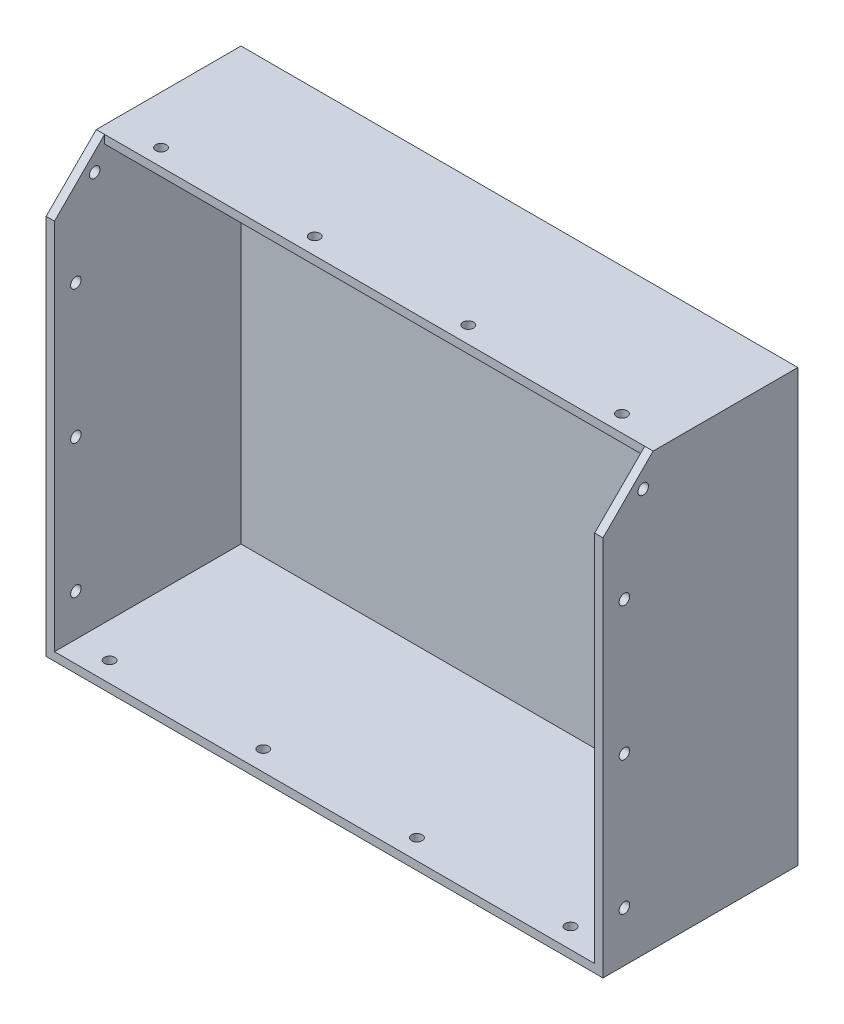
ISO-10303-21;
HEADER;
FILE_DESCRIPTION(('STEP AP214'),'2;1');
FILE_NAME('part.step','',(''),(''),'','','');
FILE_SCHEMA(('AUTOMOTIVE_DESIGN { 1 0 10303 214 1 1 1 1 }'));
ENDSEC;
DATA;
#1=APPLICATION_CONTEXT('core data for automotive mechanical design processes');
#2=APPLICATION_PROTOCOL_DEFINITION('international standard','automotive_design',2000,#1);
#3=PRODUCT_CONTEXT('',#1,'mechanical');
#4=PRODUCT('Part','Part','',(#3));
#5=PRODUCT_RELATED_PRODUCT_CATEGORY('part','',(#4));
#6=PRODUCT_DEFINITION_FORMATION('','',#4);
#7=PRODUCT_DEFINITION_CONTEXT('part definition',#1,'design');
#8=PRODUCT_DEFINITION('design','',#6,#7);
#9=PRODUCT_DEFINITION_SHAPE('','',#8);
#10=(LENGTH_UNIT() NAMED_UNIT(*) SI_UNIT(.MILLI.,.METRE.));
#11=(NAMED_UNIT(*) PLANE_ANGLE_UNIT() SI_UNIT($,.RADIAN.));
#12=(NAMED_UNIT(*) SI_UNIT($,.STERADIAN.) SOLID_ANGLE_UNIT());
#13=UNCERTAINTY_MEASURE_WITH_UNIT(LENGTH_MEASURE(1.E-05),#10,'distance_accuracy_value','');
#14=(GEOMETRIC_REPRESENTATION_CONTEXT(3) GLOBAL_UNCERTAINTY_ASSIGNED_CONTEXT((#13)) GLOBAL_UNIT_ASSIGNED_CONTEXT((#10,
#11,#12)) REPRESENTATION_CONTEXT('',''));
#15=CARTESIAN_POINT('',(0.,0.,0.));
#16=DIRECTION('',(0.,0.,1.));
#17=DIRECTION('',(1.,0.,0.));
#18=AXIS2_PLACEMENT_3D('',#15,#16,#17);
#19=CARTESIAN_POINT('',(87.6723333333333,-82.001,48.6833333333334));
#20=DIRECTION('',(0.,1.,0.));
#21=DIRECTION('',(0.,0.,1.));
#22=AXIS2_PLACEMENT_3D('',#19,#20,#21);
#23=CYLINDRICAL_SURFACE('',#22,2.);
#24=CARTESIAN_POINT('',(87.6723333333333,78.825,48.6833333333334));
#25=DIRECTION('',(0.,-1.,0.));
#26=DIRECTION('',(0.,0.,-1.));
#27=AXIS2_PLACEMENT_3D('',#24,#25,#26);
#28=CIRCLE('',#27,2.);
#29=CARTESIAN_POINT('',(87.6723333333333,78.825,46.6833333333334));
#30=VERTEX_POINT('',#29);
#31=EDGE_CURVE('E52',#30,#30,#28,.F.);
#32=ORIENTED_EDGE('',*,*,#31,.F.);
#33=EDGE_LOOP('',(#32));
#34=FACE_BOUND('',#33,.T.);
#35=CARTESIAN_POINT('',(87.6723333333333,82.,48.6833333333334));
#36=DIRECTION('',(0.,1.,0.));
#37=DIRECTION('',(0.,0.,1.));
#38=AXIS2_PLACEMENT_3D('',#35,#36,#37);
#39=CIRCLE('',#38,2.);
#40=CARTESIAN_POINT('',(87.6723333333333,82.,50.6833333333334));
#41=VERTEX_POINT('',#40);
#42=EDGE_CURVE('E11',#41,#41,#39,.T.);
#43=ORIENTED_EDGE('',*,*,#42,.T.);
#44=EDGE_LOOP('',(#43));
#45=FACE_BOUND('',#44,.T.);
#46=ADVANCED_FACE('F44',(#34,#45),#23,.F.);
#47=CARTESIAN_POINT('',(29.2523333333333,-82.001,48.6833333333334));
#48=DIRECTION('',(0.,1.,0.));
#49=DIRECTION('',(0.,0.,1.));
#50=AXIS2_PLACEMENT_3D('',#47,#48,#49);
#51=CYLINDRICAL_SURFACE('',#50,2.);
#52=CARTESIAN_POINT('',(29.2523333333333,78.825,48.6833333333334));
#53=DIRECTION('',(0.,-1.,0.));
#54=DIRECTION('',(0.,0.,-1.));
#55=AXIS2_PLACEMENT_3D('',#52,#53,#54);
#56=CIRCLE('',#55,2.);
#57=CARTESIAN_POINT('',(29.2523333333333,78.825,46.6833333333334));
#58=VERTEX_POINT('',#57);
#59=EDGE_CURVE('E157',#58,#58,#56,.F.);
#60=ORIENTED_EDGE('',*,*,#59,.F.);
#61=EDGE_LOOP('',(#60));
#62=FACE_BOUND('',#61,.T.);
#63=CARTESIAN_POINT('',(29.2523333333333,82.,48.6833333333334));
#64=DIRECTION('',(0.,1.,0.));
#65=DIRECTION('',(0.,0.,1.));
#66=AXIS2_PLACEMENT_3D('',#63,#64,#65);
#67=CIRCLE('',#66,2.);
#68=CARTESIAN_POINT('',(29.2523333333333,82.,50.6833333333334));
#69=VERTEX_POINT('',#68);
#70=EDGE_CURVE('E160',#69,#69,#67,.T.);
#71=ORIENTED_EDGE('',*,*,#70,.T.);
#72=EDGE_LOOP('',(#71));
#73=FACE_BOUND('',#72,.T.);
#74=ADVANCED_FACE('F170',(#62,#73),#51,.F.);
#75=CARTESIAN_POINT('',(85.8943333333333,82.001,66.4633333333333));
#76=DIRECTION('',(0.,-1.,0.));
#77=DIRECTION('',(0.,0.,-1.));
#78=AXIS2_PLACEMENT_3D('',#75,#76,#77);
#79=CYLINDRICAL_SURFACE('',#78,2.);
#80=CARTESIAN_POINT('',(85.8943333333333,-78.825,66.4633333333333));
#81=DIRECTION('',(0.,1.,0.));
#82=DIRECTION('',(0.,0.,1.));
#83=AXIS2_PLACEMENT_3D('',#80,#81,#82);
#84=CIRCLE('',#83,2.);
#85=CARTESIAN_POINT('',(85.8943333333333,-78.825,68.4633333333333));
#86=VERTEX_POINT('',#85);
#87=EDGE_CURVE('E151',#86,#86,#84,.F.);
#88=ORIENTED_EDGE('',*,*,#87,.F.);
#89=EDGE_LOOP('',(#88));
#90=FACE_BOUND('',#89,.T.);
#91=CARTESIAN_POINT('',(85.8943333333333,-82.,66.4633333333333));
#92=DIRECTION('',(0.,-1.,0.));
#93=DIRECTION('',(0.,0.,-1.));
#94=AXIS2_PLACEMENT_3D('',#91,#92,#93);
#95=CIRCLE('',#94,2.);
#96=CARTESIAN_POINT('',(85.8943333333333,-82.,64.4633333333333));
#97=VERTEX_POINT('',#96);
#98=EDGE_CURVE('E154',#97,#97,#95,.T.);
#99=ORIENTED_EDGE('',*,*,#98,.T.);
#100=EDGE_LOOP('',(#99));
#101=FACE_BOUND('',#100,.T.);
#102=ADVANCED_FACE('F203',(#90,#101),#79,.F.);
#103=CARTESIAN_POINT('',(27.4743333333333,82.001,66.4633333333333));
#104=DIRECTION('',(0.,-1.,0.));
#105=DIRECTION('',(0.,0.,-1.));
#106=AXIS2_PLACEMENT_3D('',#103,#104,#105);
#107=CYLINDRICAL_SURFACE('',#106,2.);
#108=CARTESIAN_POINT('',(27.4743333333333,-78.825,66.4633333333333));
#109=DIRECTION('',(0.,1.,0.));
#110=DIRECTION('',(0.,0.,1.));
#111=AXIS2_PLACEMENT_3D('',#108,#109,#110);
#112=CIRCLE('',#111,2.);
#113=CARTESIAN_POINT('',(27.4743333333333,-78.825,68.4633333333333));
#114=VERTEX_POINT('',#113);
#115=EDGE_CURVE('E145',#114,#114,#112,.F.);
#116=ORIENTED_EDGE('',*,*,#115,.F.);
#117=EDGE_LOOP('',(#116));
#118=FACE_BOUND('',#117,.T.);
#119=CARTESIAN_POINT('',(27.4743333333333,-82.,66.4633333333333));
#120=DIRECTION('',(0.,-1.,0.));
#121=DIRECTION('',(0.,0.,-1.));
#122=AXIS2_PLACEMENT_3D('',#119,#120,#121);
#123=CIRCLE('',#122,2.);
#124=CARTESIAN_POINT('',(27.4743333333333,-82.,64.4633333333333));
#125=VERTEX_POINT('',#124);
#126=EDGE_CURVE('E148',#125,#125,#123,.T.);
#127=ORIENTED_EDGE('',*,*,#126,.T.);
#128=EDGE_LOOP('',(#127));
#129=FACE_BOUND('',#128,.T.);
#130=ADVANCED_FACE('F199',(#118,#129),#107,.F.);
#131=CARTESIAN_POINT('',(105.875666666667,38.65,65.9553333333333));
#132=DIRECTION('',(-1.,0.,0.));
#133=DIRECTION('',(0.,0.,1.));
#134=AXIS2_PLACEMENT_3D('',#131,#132,#133);
#135=CYLINDRICAL_SURFACE('',#134,2.);
#136=CARTESIAN_POINT('',(-102.700666666667,38.65,65.9553333333333));
#137=DIRECTION('',(1.,0.,0.));
#138=DIRECTION('',(0.,0.,-1.));
#139=AXIS2_PLACEMENT_3D('',#136,#137,#138);
#140=CIRCLE('',#139,2.);
#141=CARTESIAN_POINT('',(-102.700666666667,38.65,63.9553333333333));
#142=VERTEX_POINT('',#141);
#143=EDGE_CURVE('E139',#142,#142,#140,.T.);
#144=ORIENTED_EDGE('',*,*,#143,.T.);
#145=EDGE_LOOP('',(#144));
#146=FACE_BOUND('',#145,.T.);
#147=CARTESIAN_POINT('',(-105.875666666667,38.65,65.9553333333333));
#148=DIRECTION('',(-1.,0.,0.));
#149=DIRECTION('',(0.,0.,1.));
#150=AXIS2_PLACEMENT_3D('',#147,#148,#149);
#151=CIRCLE('',#150,2.);
#152=CARTESIAN_POINT('',(-105.875666666667,38.65,67.9553333333333));
#153=VERTEX_POINT('',#152);
#154=EDGE_CURVE('E142',#153,#153,#151,.T.);
#155=ORIENTED_EDGE('',*,*,#154,.T.);
#156=EDGE_LOOP('',(#155));
#157=FACE_BOUND('',#156,.T.);
#158=ADVANCED_FACE('F185',(#146,#157),#135,.F.);
#159=CARTESIAN_POINT('',(105.875666666667,38.65,65.9553333333333));
#160=DIRECTION('',(-1.,0.,0.));
#161=DIRECTION('',(0.,0.,1.));
#162=AXIS2_PLACEMENT_3D('',#159,#160,#161);
#163=CYLINDRICAL_SURFACE('',#162,2.);
#164=CARTESIAN_POINT('',(105.875666666667,38.65,65.9553333333333));
#165=DIRECTION('',(-1.,0.,0.));
#166=DIRECTION('',(0.,0.,1.));
#167=AXIS2_PLACEMENT_3D('',#164,#165,#166);
#168=CIRCLE('',#167,2.);
#169=CARTESIAN_POINT('',(105.875666666667,38.65,67.9553333333333));
#170=VERTEX_POINT('',#169);
#171=EDGE_CURVE('E128',#170,#170,#168,.T.);
#172=ORIENTED_EDGE('',*,*,#171,.F.);
#173=EDGE_LOOP('',(#172));
#174=FACE_BOUND('',#173,.T.);
#175=CARTESIAN_POINT('',(102.700666666667,38.65,65.9553333333333));
#176=DIRECTION('',(1.,0.,0.));
#177=DIRECTION('',(0.,0.,-1.));
#178=AXIS2_PLACEMENT_3D('',#175,#176,#177);
#179=CIRCLE('',#178,2.);
#180=CARTESIAN_POINT('',(102.700666666667,38.65,63.9553333333333));
#181=VERTEX_POINT('',#180);
#182=EDGE_CURVE('E136',#181,#181,#179,.T.);
#183=ORIENTED_EDGE('',*,*,#182,.F.);
#184=EDGE_LOOP('',(#183));
#185=FACE_BOUND('',#184,.T.);
#186=ADVANCED_FACE('F176',(#174,#185),#163,.F.);
#187=CARTESIAN_POINT('',(-105.875666666667,82.,74.0833333333333));
#188=DIRECTION('',(0.,-1.,0.));
#189=DIRECTION('',(0.,0.,-1.));
#190=AXIS2_PLACEMENT_3D('',#187,#188,#189);
#191=PLANE('',#190);
#192=CARTESIAN_POINT('',(-29.1676666666667,82.,48.6833333333334));
#193=DIRECTION('',(0.,1.,0.));
#194=DIRECTION('',(0.,0.,1.));
#195=AXIS2_PLACEMENT_3D('',#192,#193,#194);
#196=CIRCLE('',#195,2.);
#197=CARTESIAN_POINT('',(-29.1676666666667,82.,50.6833333333333));
#198=VERTEX_POINT('',#197);
#199=EDGE_CURVE('E472',#198,#198,#196,.T.);
#200=ORIENTED_EDGE('',*,*,#199,.F.);
#201=EDGE_LOOP('',(#200));
#202=FACE_BOUND('',#201,.T.);
#203=CARTESIAN_POINT('',(-87.5876666666667,82.,48.6833333333333));
#204=DIRECTION('',(0.,1.,0.));
#205=DIRECTION('',(0.,0.,1.));
#206=AXIS2_PLACEMENT_3D('',#203,#204,#205);
#207=CIRCLE('',#206,2.);
#208=CARTESIAN_POINT('',(-87.5876666666667,82.,50.6833333333333));
#209=VERTEX_POINT('',#208);
#210=EDGE_CURVE('E478',#209,#209,#207,.T.);
#211=ORIENTED_EDGE('',*,*,#210,.F.);
#212=EDGE_LOOP('',(#211));
#213=FACE_BOUND('',#212,.T.);
#214=DIRECTION('',(-1.,0.,0.));
#215=VECTOR('',#214,1.);
#216=CARTESIAN_POINT('',(457.207176090762,82.,55.0333333333333));
#217=LINE('',#216,#215);
#218=CARTESIAN_POINT('',(105.875666666667,82.,55.0333333333333));
#219=VERTEX_POINT('',#218);
#220=CARTESIAN_POINT('',(102.700666666667,82.,55.0333333333333));
#221=VERTEX_POINT('',#220);
#222=EDGE_CURVE('E270',#219,#221,#217,.T.);
#223=ORIENTED_EDGE('',*,*,#222,.F.);
#224=DIRECTION('',(0.,0.,-1.));
#225=VECTOR('',#224,1.);
#226=CARTESIAN_POINT('',(105.875666666667,82.,74.0833333333333));
#227=LINE('',#226,#225);
#228=CARTESIAN_POINT('',(105.875666666667,82.,0.));
#229=VERTEX_POINT('',#228);
#230=EDGE_CURVE('E126',#219,#229,#227,.T.);
#231=ORIENTED_EDGE('',*,*,#230,.T.);
#232=DIRECTION('',(-1.,0.,0.));
#233=VECTOR('',#232,1.);
#234=CARTESIAN_POINT('',(-105.875666666667,82.,0.));
#235=LINE('',#234,#233);
#236=CARTESIAN_POINT('',(-105.875666666667,82.,0.));
#237=VERTEX_POINT('',#236);
#238=EDGE_CURVE('E112',#229,#237,#235,.T.);
#239=ORIENTED_EDGE('',*,*,#238,.T.);
#240=DIRECTION('',(0.,0.,-1.));
#241=VECTOR('',#240,1.);
#242=CARTESIAN_POINT('',(-105.875666666667,82.,74.0833333333333));
#243=LINE('',#242,#241);
#244=CARTESIAN_POINT('',(-105.875666666667,82.,55.0333333333333));
#245=VERTEX_POINT('',#244);
#246=EDGE_CURVE('E124',#245,#237,#243,.T.);
#247=ORIENTED_EDGE('',*,*,#246,.F.);
#248=DIRECTION('',(-1.,0.,0.));
#249=VECTOR('',#248,1.);
#250=CARTESIAN_POINT('',(-102.700666666667,82.,55.0333333333333));
#251=LINE('',#250,#249);
#252=CARTESIAN_POINT('',(-102.700666666667,82.,55.0333333333333));
#253=VERTEX_POINT('',#252);
#254=EDGE_CURVE('E285',#253,#245,#251,.T.);
#255=ORIENTED_EDGE('',*,*,#254,.F.);
#256=DIRECTION('',(-1.,0.,0.));
#257=VECTOR('',#256,1.);
#258=CARTESIAN_POINT('',(-102.700666666667,82.,55.0333333333333));
#259=LINE('',#258,#257);
#260=EDGE_CURVE('E282',#221,#253,#259,.T.);
#261=ORIENTED_EDGE('',*,*,#260,.F.);
#262=EDGE_LOOP('',(#223,#231,#239,#247,#255,#261));
#263=FACE_BOUND('',#262,.T.);
#264=ORIENTED_EDGE('',*,*,#70,.F.);
#265=EDGE_LOOP('',(#264));
#266=FACE_BOUND('',#265,.T.);
#267=ORIENTED_EDGE('',*,*,#42,.F.);
#268=EDGE_LOOP('',(#267));
#269=FACE_BOUND('',#268,.T.);
#270=ADVANCED_FACE('F173',(#202,#213,#263,#266,#269),#191,.F.);
#271=CARTESIAN_POINT('',(102.700666666667,0.,3.17500000333333));
#272=DIRECTION('',(1.,0.,0.));
#273=DIRECTION('',(0.,0.,-1.));
#274=AXIS2_PLACEMENT_3D('',#271,#272,#273);
#275=PLANE('',#274);
#276=CARTESIAN_POINT('',(102.700666666667,71.4032977771384,58.8050409041823));
#277=DIRECTION('',(1.,0.,0.));
#278=DIRECTION('',(0.,0.,-1.));
#279=AXIS2_PLACEMENT_3D('',#276,#277,#278);
#280=CIRCLE('',#279,1.99999999999998);
#281=CARTESIAN_POINT('',(102.700666666667,71.4032977771384,56.8050409041824));
#282=VERTEX_POINT('',#281);
#283=EDGE_CURVE('E467',#282,#282,#280,.T.);
#284=ORIENTED_EDGE('',*,*,#283,.T.);
#285=EDGE_LOOP('',(#284));
#286=FACE_BOUND('',#285,.T.);
#287=CARTESIAN_POINT('',(102.700666666667,-12.15,65.9553333333333));
#288=DIRECTION('',(1.,0.,0.));
#289=DIRECTION('',(0.,0.,-1.));
#290=AXIS2_PLACEMENT_3D('',#287,#288,#289);
#291=CIRCLE('',#290,2.);
#292=CARTESIAN_POINT('',(102.700666666667,-12.15,63.9553333333333));
#293=VERTEX_POINT('',#292);
#294=EDGE_CURVE('E260',#293,#293,#291,.T.);
#295=ORIENTED_EDGE('',*,*,#294,.T.);
#296=EDGE_LOOP('',(#295));
#297=FACE_BOUND('',#296,.T.);
#298=CARTESIAN_POINT('',(102.700666666667,-62.95,65.9553333333333));
#299=DIRECTION('',(1.,0.,0.));
#300=DIRECTION('',(0.,0.,-1.));
#301=AXIS2_PLACEMENT_3D('',#298,#299,#300);
#302=CIRCLE('',#301,2.);
#303=CARTESIAN_POINT('',(102.700666666667,-62.95,63.9553333333333));
#304=VERTEX_POINT('',#303);
#305=EDGE_CURVE('E132',#304,#304,#302,.T.);
#306=ORIENTED_EDGE('',*,*,#305,.T.);
#307=EDGE_LOOP('',(#306));
#308=FACE_BOUND('',#307,.T.);
#309=DIRECTION('',(0.,-0.707106781186547,0.707106781186548));
#310=VECTOR('',#309,1.);
#311=CARTESIAN_POINT('',(102.700666666667,68.5166666666667,68.5166666666667));
#312=LINE('',#311,#310);
#313=CARTESIAN_POINT('',(102.700666666667,62.95,74.0833333333333));
#314=VERTEX_POINT('',#313);
#315=EDGE_CURVE('E294',#221,#314,#312,.T.);
#316=ORIENTED_EDGE('',*,*,#315,.F.);
#317=DIRECTION('',(0.,1.,0.));
#318=VECTOR('',#317,1.);
#319=CARTESIAN_POINT('',(102.700666666667,82.,55.0333333333333));
#320=LINE('',#319,#318);
#321=CARTESIAN_POINT('',(102.700666666667,78.825,55.0333333333333));
#322=VERTEX_POINT('',#321);
#323=EDGE_CURVE('E279',#322,#221,#320,.T.);
#324=ORIENTED_EDGE('',*,*,#323,.F.);
#325=DIRECTION('',(0.,0.,1.));
#326=VECTOR('',#325,1.);
#327=CARTESIAN_POINT('',(102.700666666667,78.825,3.17500000333333));
#328=LINE('',#327,#326);
#329=CARTESIAN_POINT('',(102.700666666667,78.825,3.17500000333333));
#330=VERTEX_POINT('',#329);
#331=EDGE_CURVE('E113',#330,#322,#328,.T.);
#332=ORIENTED_EDGE('',*,*,#331,.F.);
#333=DIRECTION('',(0.,1.,0.));
#334=VECTOR('',#333,1.);
#335=CARTESIAN_POINT('',(102.700666666667,0.,3.17500000333333));
#336=LINE('',#335,#334);
#337=CARTESIAN_POINT('',(102.700666666667,-78.825,3.17500000333333));
#338=VERTEX_POINT('',#337);
#339=EDGE_CURVE('E311',#338,#330,#336,.T.);
#340=ORIENTED_EDGE('',*,*,#339,.F.);
#341=DIRECTION('',(0.,0.,1.));
#342=VECTOR('',#341,1.);
#343=CARTESIAN_POINT('',(102.700666666667,-78.825,3.17500000333333));
#344=LINE('',#343,#342);
#345=CARTESIAN_POINT('',(102.700666666667,-78.825,74.0833333333333));
#346=VERTEX_POINT('',#345);
#347=EDGE_CURVE('E117',#338,#346,#344,.T.);
#348=ORIENTED_EDGE('',*,*,#347,.T.);
#349=DIRECTION('',(0.,1.,0.));
#350=VECTOR('',#349,1.);
#351=CARTESIAN_POINT('',(102.700666666667,0.,74.0833333333333));
#352=LINE('',#351,#350);
#353=EDGE_CURVE('E305',#346,#314,#352,.T.);
#354=ORIENTED_EDGE('',*,*,#353,.T.);
#355=EDGE_LOOP('',(#316,#324,#332,#340,#348,#354));
#356=FACE_BOUND('',#355,.T.);
#357=ORIENTED_EDGE('',*,*,#182,.T.);
#358=EDGE_LOOP('',(#357));
#359=FACE_BOUND('',#358,.T.);
#360=ADVANCED_FACE('F175',(#286,#297,#308,#356,#359),#275,.F.);
#361=CARTESIAN_POINT('',(0.,78.825,3.17500000333333));
#362=DIRECTION('',(0.,-1.,0.));
#363=DIRECTION('',(0.,0.,-1.));
#364=AXIS2_PLACEMENT_3D('',#361,#362,#363);
#365=PLANE('',#364);
#366=CARTESIAN_POINT('',(-29.1676666666667,78.825,48.6833333333334));
#367=DIRECTION('',(0.,-1.,0.));
#368=DIRECTION('',(0.,0.,-1.));
#369=AXIS2_PLACEMENT_3D('',#366,#367,#368);
#370=CIRCLE('',#369,2.);
#371=CARTESIAN_POINT('',(-29.1676666666667,78.825,46.6833333333334));
#372=VERTEX_POINT('',#371);
#373=EDGE_CURVE('E470',#372,#372,#370,.F.);
#374=ORIENTED_EDGE('',*,*,#373,.T.);
#375=EDGE_LOOP('',(#374));
#376=FACE_BOUND('',#375,.T.);
#377=CARTESIAN_POINT('',(-87.5876666666667,78.825,48.6833333333333));
#378=DIRECTION('',(0.,-1.,0.));
#379=DIRECTION('',(0.,0.,-1.));
#380=AXIS2_PLACEMENT_3D('',#377,#378,#379);
#381=CIRCLE('',#380,2.);
#382=CARTESIAN_POINT('',(-87.5876666666667,78.825,46.6833333333333));
#383=VERTEX_POINT('',#382);
#384=EDGE_CURVE('E475',#383,#383,#381,.F.);
#385=ORIENTED_EDGE('',*,*,#384,.T.);
#386=EDGE_LOOP('',(#385));
#387=FACE_BOUND('',#386,.T.);
#388=ORIENTED_EDGE('',*,*,#331,.T.);
#389=DIRECTION('',(1.,0.,0.));
#390=VECTOR('',#389,1.);
#391=CARTESIAN_POINT('',(-102.700666666667,78.825,55.0333333333333));
#392=LINE('',#391,#390);
#393=CARTESIAN_POINT('',(-102.700666666667,78.825,55.0333333333333));
#394=VERTEX_POINT('',#393);
#395=EDGE_CURVE('E276',#394,#322,#392,.T.);
#396=ORIENTED_EDGE('',*,*,#395,.F.);
#397=DIRECTION('',(0.,0.,1.));
#398=VECTOR('',#397,1.);
#399=CARTESIAN_POINT('',(-102.700666666667,78.825,3.17500000333333));
#400=LINE('',#399,#398);
#401=CARTESIAN_POINT('',(-102.700666666667,78.825,3.17500000333333));
#402=VERTEX_POINT('',#401);
#403=EDGE_CURVE('E314',#402,#394,#400,.T.);
#404=ORIENTED_EDGE('',*,*,#403,.F.);
#405=DIRECTION('',(1.,0.,0.));
#406=VECTOR('',#405,1.);
#407=CARTESIAN_POINT('',(0.,78.825,3.17500000333333));
#408=LINE('',#407,#406);
#409=EDGE_CURVE('E301',#402,#330,#408,.T.);
#410=ORIENTED_EDGE('',*,*,#409,.T.);
#411=EDGE_LOOP('',(#388,#396,#404,#410));
#412=FACE_BOUND('',#411,.T.);
#413=ORIENTED_EDGE('',*,*,#59,.T.);
#414=EDGE_LOOP('',(#413));
#415=FACE_BOUND('',#414,.T.);
#416=ORIENTED_EDGE('',*,*,#31,.T.);
#417=EDGE_LOOP('',(#416));
#418=FACE_BOUND('',#417,.T.);
#419=ADVANCED_FACE('F166',(#376,#387,#412,#415,#418),#365,.T.);
#420=CARTESIAN_POINT('',(105.875666666667,-82.,74.0833333333333));
#421=DIRECTION('',(-1.,0.,0.));
#422=DIRECTION('',(0.,0.,1.));
#423=AXIS2_PLACEMENT_3D('',#420,#421,#422);
#424=PLANE('',#423);
#425=CARTESIAN_POINT('',(105.875666666667,71.4032977771384,58.8050409041823));
#426=DIRECTION('',(-1.,0.,0.));
#427=DIRECTION('',(0.,0.,1.));
#428=AXIS2_PLACEMENT_3D('',#425,#426,#427);
#429=CIRCLE('',#428,1.99999999999998);
#430=CARTESIAN_POINT('',(105.875666666667,71.4032977771384,60.8050409041823));
#431=VERTEX_POINT('',#430);
#432=EDGE_CURVE('E462',#431,#431,#429,.T.);
#433=ORIENTED_EDGE('',*,*,#432,.T.);
#434=EDGE_LOOP('',(#433));
#435=FACE_BOUND('',#434,.T.);
#436=CARTESIAN_POINT('',(105.875666666667,-12.15,65.9553333333333));
#437=DIRECTION('',(-1.,0.,0.));
#438=DIRECTION('',(0.,0.,1.));
#439=AXIS2_PLACEMENT_3D('',#436,#437,#438);
#440=CIRCLE('',#439,2.);
#441=CARTESIAN_POINT('',(105.875666666667,-12.15,67.9553333333333));
#442=VERTEX_POINT('',#441);
#443=EDGE_CURVE('E257',#442,#442,#440,.T.);
#444=ORIENTED_EDGE('',*,*,#443,.T.);
#445=EDGE_LOOP('',(#444));
#446=FACE_BOUND('',#445,.T.);
#447=CARTESIAN_POINT('',(105.875666666667,-62.95,65.9553333333333));
#448=DIRECTION('',(-1.,0.,0.));
#449=DIRECTION('',(0.,0.,1.));
#450=AXIS2_PLACEMENT_3D('',#447,#448,#449);
#451=CIRCLE('',#450,2.);
#452=CARTESIAN_POINT('',(105.875666666667,-62.95,67.9553333333333));
#453=VERTEX_POINT('',#452);
#454=EDGE_CURVE('E133',#453,#453,#451,.T.);
#455=ORIENTED_EDGE('',*,*,#454,.T.);
#456=EDGE_LOOP('',(#455));
#457=FACE_BOUND('',#456,.T.);
#458=ORIENTED_EDGE('',*,*,#230,.F.);
#459=DIRECTION('',(0.,0.707106781186547,-0.707106781186548));
#460=VECTOR('',#459,1.);
#461=CARTESIAN_POINT('',(105.875666666667,68.5166666666667,68.5166666666667));
#462=LINE('',#461,#460);
#463=CARTESIAN_POINT('',(105.875666666667,62.95,74.0833333333333));
#464=VERTEX_POINT('',#463);
#465=EDGE_CURVE('E297',#464,#219,#462,.T.);
#466=ORIENTED_EDGE('',*,*,#465,.F.);
#467=DIRECTION('',(0.,1.,0.));
#468=VECTOR('',#467,1.);
#469=CARTESIAN_POINT('',(105.875666666667,-82.,74.0833333333333));
#470=LINE('',#469,#468);
#471=CARTESIAN_POINT('',(105.875666666667,-82.,74.0833333333333));
#472=VERTEX_POINT('',#471);
#473=EDGE_CURVE('E98',#472,#464,#470,.T.);
#474=ORIENTED_EDGE('',*,*,#473,.F.);
#475=DIRECTION('',(0.,0.,-1.));
#476=VECTOR('',#475,1.);
#477=CARTESIAN_POINT('',(105.875666666667,-82.,74.0833333333333));
#478=LINE('',#477,#476);
#479=CARTESIAN_POINT('',(105.875666666667,-82.,0.));
#480=VERTEX_POINT('',#479);
#481=EDGE_CURVE('E91',#472,#480,#478,.T.);
#482=ORIENTED_EDGE('',*,*,#481,.T.);
#483=DIRECTION('',(0.,1.,0.));
#484=VECTOR('',#483,1.);
#485=CARTESIAN_POINT('',(105.875666666667,-82.,0.));
#486=LINE('',#485,#484);
#487=EDGE_CURVE('E106',#480,#229,#486,.T.);
#488=ORIENTED_EDGE('',*,*,#487,.T.);
#489=EDGE_LOOP('',(#458,#466,#474,#482,#488));
#490=FACE_BOUND('',#489,.T.);
#491=ORIENTED_EDGE('',*,*,#171,.T.);
#492=EDGE_LOOP('',(#491));
#493=FACE_BOUND('',#492,.T.);
#494=ADVANCED_FACE('F104',(#435,#446,#457,#490,#493),#424,.F.);
#495=CARTESIAN_POINT('',(-105.875666666667,-82.,74.0833333333333));
#496=DIRECTION('',(1.,0.,0.));
#497=DIRECTION('',(0.,0.,-1.));
#498=AXIS2_PLACEMENT_3D('',#495,#496,#497);
#499=PLANE('',#498);
#500=CARTESIAN_POINT('',(-105.875666666667,71.4032977771384,58.8050409041823));
#501=DIRECTION('',(-1.,0.,0.));
#502=DIRECTION('',(0.,0.,1.));
#503=AXIS2_PLACEMENT_3D('',#500,#501,#502);
#504=CIRCLE('',#503,1.99999999999998);
#505=CARTESIAN_POINT('',(-105.875666666667,71.4032977771384,60.8050409041823));
#506=VERTEX_POINT('',#505);
#507=EDGE_CURVE('E458',#506,#506,#504,.T.);
#508=ORIENTED_EDGE('',*,*,#507,.F.);
#509=EDGE_LOOP('',(#508));
#510=FACE_BOUND('',#509,.T.);
#511=CARTESIAN_POINT('',(-105.875666666667,-12.15,65.9553333333333));
#512=DIRECTION('',(-1.,0.,0.));
#513=DIRECTION('',(0.,0.,1.));
#514=AXIS2_PLACEMENT_3D('',#511,#512,#513);
#515=CIRCLE('',#514,2.);
#516=CARTESIAN_POINT('',(-105.875666666667,-12.15,67.9553333333333));
#517=VERTEX_POINT('',#516);
#518=EDGE_CURVE('E248',#517,#517,#515,.T.);
#519=ORIENTED_EDGE('',*,*,#518,.F.);
#520=EDGE_LOOP('',(#519));
#521=FACE_BOUND('',#520,.T.);
#522=CARTESIAN_POINT('',(-105.875666666667,-62.95,65.9553333333333));
#523=DIRECTION('',(-1.,0.,0.));
#524=DIRECTION('',(0.,0.,1.));
#525=AXIS2_PLACEMENT_3D('',#522,#523,#524);
#526=CIRCLE('',#525,2.);
#527=CARTESIAN_POINT('',(-105.875666666667,-62.95,67.9553333333333));
#528=VERTEX_POINT('',#527);
#529=EDGE_CURVE('E263',#528,#528,#526,.T.);
#530=ORIENTED_EDGE('',*,*,#529,.F.);
#531=EDGE_LOOP('',(#530));
#532=FACE_BOUND('',#531,.T.);
#533=DIRECTION('',(0.,-0.707106781186547,0.707106781186548));
#534=VECTOR('',#533,1.);
#535=CARTESIAN_POINT('',(-105.875666666667,68.5166666666667,68.5166666666667));
#536=LINE('',#535,#534);
#537=CARTESIAN_POINT('',(-105.875666666667,62.95,74.0833333333333));
#538=VERTEX_POINT('',#537);
#539=EDGE_CURVE('E288',#245,#538,#536,.T.);
#540=ORIENTED_EDGE('',*,*,#539,.F.);
#541=ORIENTED_EDGE('',*,*,#246,.T.);
#542=DIRECTION('',(0.,-1.,0.));
#543=VECTOR('',#542,1.);
#544=CARTESIAN_POINT('',(-105.875666666667,-82.,0.));
#545=LINE('',#544,#543);
#546=CARTESIAN_POINT('',(-105.875666666667,-82.,0.));
#547=VERTEX_POINT('',#546);
#548=EDGE_CURVE('E99',#237,#547,#545,.T.);
#549=ORIENTED_EDGE('',*,*,#548,.T.);
#550=DIRECTION('',(0.,0.,-1.));
#551=VECTOR('',#550,1.);
#552=CARTESIAN_POINT('',(-105.875666666667,-82.,74.0833333333333));
#553=LINE('',#552,#551);
#554=CARTESIAN_POINT('',(-105.875666666667,-82.,74.0833333333333));
#555=VERTEX_POINT('',#554);
#556=EDGE_CURVE('E94',#555,#547,#553,.T.);
#557=ORIENTED_EDGE('',*,*,#556,.F.);
#558=DIRECTION('',(0.,-1.,0.));
#559=VECTOR('',#558,1.);
#560=CARTESIAN_POINT('',(-105.875666666667,-82.,74.0833333333333));
#561=LINE('',#560,#559);
#562=EDGE_CURVE('E329',#538,#555,#561,.T.);
#563=ORIENTED_EDGE('',*,*,#562,.F.);
#564=EDGE_LOOP('',(#540,#541,#549,#557,#563));
#565=FACE_BOUND('',#564,.T.);
#566=ORIENTED_EDGE('',*,*,#154,.F.);
#567=EDGE_LOOP('',(#566));
#568=FACE_BOUND('',#567,.T.);
#569=ADVANCED_FACE('F192',(#510,#521,#532,#565,#568),#499,.F.);
#570=CARTESIAN_POINT('',(0.,0.,74.0833333333333));
#571=DIRECTION('',(0.,0.,-1.));
#572=DIRECTION('',(-1.,0.,0.));
#573=AXIS2_PLACEMENT_3D('',#570,#571,#572);
#574=PLANE('',#573);
#575=ORIENTED_EDGE('',*,*,#473,.T.);
#576=DIRECTION('',(-1.,0.,0.));
#577=VECTOR('',#576,1.);
#578=CARTESIAN_POINT('',(105.876666666667,62.95,74.0833333333333));
#579=LINE('',#578,#577);
#580=EDGE_CURVE('E291',#464,#314,#579,.T.);
#581=ORIENTED_EDGE('',*,*,#580,.T.);
#582=ORIENTED_EDGE('',*,*,#353,.F.);
#583=DIRECTION('',(-1.,0.,0.));
#584=VECTOR('',#583,1.);
#585=CARTESIAN_POINT('',(0.,-78.825,74.0833333333333));
#586=LINE('',#585,#584);
#587=CARTESIAN_POINT('',(-102.700666666667,-78.825,74.0833333333333));
#588=VERTEX_POINT('',#587);
#589=EDGE_CURVE('E317',#346,#588,#586,.T.);
#590=ORIENTED_EDGE('',*,*,#589,.T.);
#591=DIRECTION('',(0.,1.,0.));
#592=VECTOR('',#591,1.);
#593=CARTESIAN_POINT('',(-102.700666666667,0.,74.0833333333333));
#594=LINE('',#593,#592);
#595=CARTESIAN_POINT('',(-102.700666666667,62.95,74.0833333333333));
#596=VERTEX_POINT('',#595);
#597=EDGE_CURVE('E300',#588,#596,#594,.T.);
#598=ORIENTED_EDGE('',*,*,#597,.T.);
#599=EDGE_CURVE('E59',#596,#538,#579,.T.);
#600=ORIENTED_EDGE('',*,*,#599,.T.);
#601=ORIENTED_EDGE('',*,*,#562,.T.);
#602=DIRECTION('',(1.,0.,0.));
#603=VECTOR('',#602,1.);
#604=CARTESIAN_POINT('',(-105.875666666667,-82.,74.0833333333333));
#605=LINE('',#604,#603);
#606=EDGE_CURVE('E68',#555,#472,#605,.T.);
#607=ORIENTED_EDGE('',*,*,#606,.T.);
#608=EDGE_LOOP('',(#575,#581,#582,#590,#598,#600,#601,#607));
#609=FACE_BOUND('',#608,.T.);
#610=ADVANCED_FACE('F227',(#609),#574,.F.);
#611=CARTESIAN_POINT('',(-105.875666666667,-82.,74.0833333333333));
#612=DIRECTION('',(0.,1.,0.));
#613=DIRECTION('',(0.,0.,1.));
#614=AXIS2_PLACEMENT_3D('',#611,#612,#613);
#615=PLANE('',#614);
#616=CARTESIAN_POINT('',(-30.9456666666667,-82.,66.4633333333333));
#617=DIRECTION('',(0.,-1.,0.));
#618=DIRECTION('',(0.,0.,-1.));
#619=AXIS2_PLACEMENT_3D('',#616,#617,#618);
#620=CIRCLE('',#619,2.);
#621=CARTESIAN_POINT('',(-30.9456666666667,-82.,64.4633333333333));
#622=VERTEX_POINT('',#621);
#623=EDGE_CURVE('E239',#622,#622,#620,.T.);
#624=ORIENTED_EDGE('',*,*,#623,.F.);
#625=EDGE_LOOP('',(#624));
#626=FACE_BOUND('',#625,.T.);
#627=CARTESIAN_POINT('',(-89.3656666666667,-82.,66.4633333333333));
#628=DIRECTION('',(0.,-1.,0.));
#629=DIRECTION('',(0.,0.,-1.));
#630=AXIS2_PLACEMENT_3D('',#627,#628,#629);
#631=CIRCLE('',#630,2.);
#632=CARTESIAN_POINT('',(-89.3656666666667,-82.,64.4633333333333));
#633=VERTEX_POINT('',#632);
#634=EDGE_CURVE('E242',#633,#633,#631,.T.);
#635=ORIENTED_EDGE('',*,*,#634,.F.);
#636=EDGE_LOOP('',(#635));
#637=FACE_BOUND('',#636,.T.);
#638=DIRECTION('',(1.,0.,0.));
#639=VECTOR('',#638,1.);
#640=CARTESIAN_POINT('',(-105.875666666667,-82.,0.));
#641=LINE('',#640,#639);
#642=EDGE_CURVE('E87',#547,#480,#641,.T.);
#643=ORIENTED_EDGE('',*,*,#642,.T.);
#644=ORIENTED_EDGE('',*,*,#481,.F.);
#645=ORIENTED_EDGE('',*,*,#606,.F.);
#646=ORIENTED_EDGE('',*,*,#556,.T.);
#647=EDGE_LOOP('',(#643,#644,#645,#646));
#648=FACE_BOUND('',#647,.T.);
#649=ORIENTED_EDGE('',*,*,#126,.F.);
#650=EDGE_LOOP('',(#649));
#651=FACE_BOUND('',#650,.T.);
#652=ORIENTED_EDGE('',*,*,#98,.F.);
#653=EDGE_LOOP('',(#652));
#654=FACE_BOUND('',#653,.T.);
#655=ADVANCED_FACE('F89',(#626,#637,#648,#651,#654),#615,.F.);
#656=CARTESIAN_POINT('',(0.,0.,0.));
#657=DIRECTION('',(0.,0.,-1.));
#658=DIRECTION('',(-1.,0.,0.));
#659=AXIS2_PLACEMENT_3D('',#656,#657,#658);
#660=PLANE('',#659);
#661=ORIENTED_EDGE('',*,*,#487,.F.);
#662=ORIENTED_EDGE('',*,*,#642,.F.);
#663=ORIENTED_EDGE('',*,*,#548,.F.);
#664=ORIENTED_EDGE('',*,*,#238,.F.);
#665=EDGE_LOOP('',(#661,#662,#663,#664));
#666=FACE_BOUND('',#665,.T.);
#667=ADVANCED_FACE('F110',(#666),#660,.T.);
#668=CARTESIAN_POINT('',(0.,-78.825,3.17500000333333));
#669=DIRECTION('',(0.,1.,0.));
#670=DIRECTION('',(0.,0.,1.));
#671=AXIS2_PLACEMENT_3D('',#668,#669,#670);
#672=PLANE('',#671);
#673=CARTESIAN_POINT('',(-30.9456666666667,-78.825,66.4633333333333));
#674=DIRECTION('',(0.,1.,0.));
#675=DIRECTION('',(0.,0.,1.));
#676=AXIS2_PLACEMENT_3D('',#673,#674,#675);
#677=CIRCLE('',#676,2.);
#678=CARTESIAN_POINT('',(-30.9456666666667,-78.825,68.4633333333333));
#679=VERTEX_POINT('',#678);
#680=EDGE_CURVE('E418',#679,#679,#677,.F.);
#681=ORIENTED_EDGE('',*,*,#680,.T.);
#682=EDGE_LOOP('',(#681));
#683=FACE_BOUND('',#682,.T.);
#684=CARTESIAN_POINT('',(-89.3656666666667,-78.825,66.4633333333333));
#685=DIRECTION('',(0.,1.,0.));
#686=DIRECTION('',(0.,0.,1.));
#687=AXIS2_PLACEMENT_3D('',#684,#685,#686);
#688=CIRCLE('',#687,2.);
#689=CARTESIAN_POINT('',(-89.3656666666667,-78.825,68.4633333333333));
#690=VERTEX_POINT('',#689);
#691=EDGE_CURVE('E245',#690,#690,#688,.F.);
#692=ORIENTED_EDGE('',*,*,#691,.T.);
#693=EDGE_LOOP('',(#692));
#694=FACE_BOUND('',#693,.T.);
#695=ORIENTED_EDGE('',*,*,#589,.F.);
#696=ORIENTED_EDGE('',*,*,#347,.F.);
#697=DIRECTION('',(-1.,0.,0.));
#698=VECTOR('',#697,1.);
#699=CARTESIAN_POINT('',(0.,-78.825,3.17500000333333));
#700=LINE('',#699,#698);
#701=CARTESIAN_POINT('',(-102.700666666667,-78.825,3.17500000333333));
#702=VERTEX_POINT('',#701);
#703=EDGE_CURVE('E308',#338,#702,#700,.T.);
#704=ORIENTED_EDGE('',*,*,#703,.T.);
#705=DIRECTION('',(0.,0.,1.));
#706=VECTOR('',#705,1.);
#707=CARTESIAN_POINT('',(-102.700666666667,-78.825,3.17500000333333));
#708=LINE('',#707,#706);
#709=EDGE_CURVE('E324',#702,#588,#708,.T.);
#710=ORIENTED_EDGE('',*,*,#709,.T.);
#711=EDGE_LOOP('',(#695,#696,#704,#710));
#712=FACE_BOUND('',#711,.T.);
#713=ORIENTED_EDGE('',*,*,#115,.T.);
#714=EDGE_LOOP('',(#713));
#715=FACE_BOUND('',#714,.T.);
#716=ORIENTED_EDGE('',*,*,#87,.T.);
#717=EDGE_LOOP('',(#716));
#718=FACE_BOUND('',#717,.T.);
#719=ADVANCED_FACE('F231',(#683,#694,#712,#715,#718),#672,.T.);
#720=CARTESIAN_POINT('',(-102.700666666667,0.,3.17500000333333));
#721=DIRECTION('',(1.,0.,0.));
#722=DIRECTION('',(0.,0.,-1.));
#723=AXIS2_PLACEMENT_3D('',#720,#721,#722);
#724=PLANE('',#723);
#725=CARTESIAN_POINT('',(-102.700666666667,71.4032977771384,58.8050409041823));
#726=DIRECTION('',(1.,0.,0.));
#727=DIRECTION('',(0.,0.,-1.));
#728=AXIS2_PLACEMENT_3D('',#725,#726,#727);
#729=CIRCLE('',#728,1.99999999999998);
#730=CARTESIAN_POINT('',(-102.700666666667,71.4032977771384,56.8050409041824));
#731=VERTEX_POINT('',#730);
#732=EDGE_CURVE('E47',#731,#731,#729,.T.);
#733=ORIENTED_EDGE('',*,*,#732,.F.);
#734=EDGE_LOOP('',(#733));
#735=FACE_BOUND('',#734,.T.);
#736=CARTESIAN_POINT('',(-102.700666666667,-12.15,65.9553333333333));
#737=DIRECTION('',(1.,0.,0.));
#738=DIRECTION('',(0.,0.,-1.));
#739=AXIS2_PLACEMENT_3D('',#736,#737,#738);
#740=CIRCLE('',#739,2.);
#741=CARTESIAN_POINT('',(-102.700666666667,-12.15,63.9553333333333));
#742=VERTEX_POINT('',#741);
#743=EDGE_CURVE('E244',#742,#742,#740,.T.);
#744=ORIENTED_EDGE('',*,*,#743,.F.);
#745=EDGE_LOOP('',(#744));
#746=FACE_BOUND('',#745,.T.);
#747=CARTESIAN_POINT('',(-102.700666666667,-62.95,65.9553333333333));
#748=DIRECTION('',(1.,0.,0.));
#749=DIRECTION('',(0.,0.,-1.));
#750=AXIS2_PLACEMENT_3D('',#747,#748,#749);
#751=CIRCLE('',#750,2.);
#752=CARTESIAN_POINT('',(-102.700666666667,-62.95,63.9553333333333));
#753=VERTEX_POINT('',#752);
#754=EDGE_CURVE('E129',#753,#753,#751,.T.);
#755=ORIENTED_EDGE('',*,*,#754,.F.);
#756=EDGE_LOOP('',(#755));
#757=FACE_BOUND('',#756,.T.);
#758=DIRECTION('',(0.,-0.707106781186547,0.707106781186548));
#759=VECTOR('',#758,1.);
#760=CARTESIAN_POINT('',(-102.700666666667,68.5166666666667,68.5166666666667));
#761=LINE('',#760,#759);
#762=EDGE_CURVE('E292',#253,#596,#761,.T.);
#763=ORIENTED_EDGE('',*,*,#762,.T.);
#764=ORIENTED_EDGE('',*,*,#597,.F.);
#765=ORIENTED_EDGE('',*,*,#709,.F.);
#766=DIRECTION('',(0.,1.,0.));
#767=VECTOR('',#766,1.);
#768=CARTESIAN_POINT('',(-102.700666666667,0.,3.17500000333333));
#769=LINE('',#768,#767);
#770=EDGE_CURVE('E304',#702,#402,#769,.T.);
#771=ORIENTED_EDGE('',*,*,#770,.T.);
#772=ORIENTED_EDGE('',*,*,#403,.T.);
#773=DIRECTION('',(0.,-1.,0.));
#774=VECTOR('',#773,1.);
#775=CARTESIAN_POINT('',(-102.700666666667,82.,55.0333333333333));
#776=LINE('',#775,#774);
#777=EDGE_CURVE('E273',#253,#394,#776,.T.);
#778=ORIENTED_EDGE('',*,*,#777,.F.);
#779=EDGE_LOOP('',(#763,#764,#765,#771,#772,#778));
#780=FACE_BOUND('',#779,.T.);
#781=ORIENTED_EDGE('',*,*,#143,.F.);
#782=EDGE_LOOP('',(#781));
#783=FACE_BOUND('',#782,.T.);
#784=ADVANCED_FACE('F225',(#735,#746,#757,#780,#783),#724,.T.);
#785=CARTESIAN_POINT('',(0.,0.,3.17500000333333));
#786=DIRECTION('',(0.,0.,1.));
#787=DIRECTION('',(1.,0.,0.));
#788=AXIS2_PLACEMENT_3D('',#785,#786,#787);
#789=PLANE('',#788);
#790=ORIENTED_EDGE('',*,*,#409,.F.);
#791=ORIENTED_EDGE('',*,*,#770,.F.);
#792=ORIENTED_EDGE('',*,*,#703,.F.);
#793=ORIENTED_EDGE('',*,*,#339,.T.);
#794=EDGE_LOOP('',(#790,#791,#792,#793));
#795=FACE_BOUND('',#794,.T.);
#796=ADVANCED_FACE('F394',(#795),#789,.T.);
#797=CARTESIAN_POINT('',(105.876666666667,68.5166666666667,68.5166666666667));
#798=DIRECTION('',(0.,-0.707106781186548,-0.707106781186547));
#799=DIRECTION('',(0.,0.707106781186547,-0.707106781186548));
#800=AXIS2_PLACEMENT_3D('',#797,#798,#799);
#801=PLANE('',#800);
#802=ORIENTED_EDGE('',*,*,#465,.T.);
#803=ORIENTED_EDGE('',*,*,#222,.T.);
#804=ORIENTED_EDGE('',*,*,#315,.T.);
#805=ORIENTED_EDGE('',*,*,#580,.F.);
#806=EDGE_LOOP('',(#802,#803,#804,#805));
#807=FACE_BOUND('',#806,.T.);
#808=ADVANCED_FACE('F384',(#807),#801,.F.);
#809=ORIENTED_EDGE('',*,*,#762,.F.);
#810=ORIENTED_EDGE('',*,*,#254,.T.);
#811=ORIENTED_EDGE('',*,*,#539,.T.);
#812=ORIENTED_EDGE('',*,*,#599,.F.);
#813=EDGE_LOOP('',(#809,#810,#811,#812));
#814=FACE_BOUND('',#813,.T.);
#815=ADVANCED_FACE('F397',(#814),#801,.F.);
#816=CARTESIAN_POINT('',(0.,0.,55.0333333333333));
#817=DIRECTION('',(0.,0.,1.));
#818=DIRECTION('',(1.,0.,0.));
#819=AXIS2_PLACEMENT_3D('',#816,#817,#818);
#820=PLANE('',#819);
#821=ORIENTED_EDGE('',*,*,#777,.T.);
#822=ORIENTED_EDGE('',*,*,#395,.T.);
#823=ORIENTED_EDGE('',*,*,#323,.T.);
#824=ORIENTED_EDGE('',*,*,#260,.T.);
#825=EDGE_LOOP('',(#821,#822,#823,#824));
#826=FACE_BOUND('',#825,.T.);
#827=ADVANCED_FACE('F387',(#826),#820,.T.);
#828=CARTESIAN_POINT('',(105.875666666667,-62.95,65.9553333333333));
#829=DIRECTION('',(-1.,0.,0.));
#830=DIRECTION('',(0.,0.,1.));
#831=AXIS2_PLACEMENT_3D('',#828,#829,#830);
#832=CYLINDRICAL_SURFACE('',#831,2.);
#833=ORIENTED_EDGE('',*,*,#754,.T.);
#834=EDGE_LOOP('',(#833));
#835=FACE_BOUND('',#834,.T.);
#836=ORIENTED_EDGE('',*,*,#529,.T.);
#837=EDGE_LOOP('',(#836));
#838=FACE_BOUND('',#837,.T.);
#839=ADVANCED_FACE('F404',(#835,#838),#832,.F.);
#840=ORIENTED_EDGE('',*,*,#454,.F.);
#841=EDGE_LOOP('',(#840));
#842=FACE_BOUND('',#841,.T.);
#843=ORIENTED_EDGE('',*,*,#305,.F.);
#844=EDGE_LOOP('',(#843));
#845=FACE_BOUND('',#844,.T.);
#846=ADVANCED_FACE('F439',(#842,#845),#832,.F.);
#847=CARTESIAN_POINT('',(105.875666666667,-12.15,65.9553333333333));
#848=DIRECTION('',(-1.,0.,0.));
#849=DIRECTION('',(0.,0.,1.));
#850=AXIS2_PLACEMENT_3D('',#847,#848,#849);
#851=CYLINDRICAL_SURFACE('',#850,2.);
#852=ORIENTED_EDGE('',*,*,#443,.F.);
#853=EDGE_LOOP('',(#852));
#854=FACE_BOUND('',#853,.T.);
#855=ORIENTED_EDGE('',*,*,#294,.F.);
#856=EDGE_LOOP('',(#855));
#857=FACE_BOUND('',#856,.T.);
#858=ADVANCED_FACE('F433',(#854,#857),#851,.F.);
#859=CARTESIAN_POINT('',(105.875666666667,-12.15,65.9553333333333));
#860=DIRECTION('',(-1.,0.,0.));
#861=DIRECTION('',(0.,0.,1.));
#862=AXIS2_PLACEMENT_3D('',#859,#860,#861);
#863=CYLINDRICAL_SURFACE('',#862,2.);
#864=ORIENTED_EDGE('',*,*,#743,.T.);
#865=EDGE_LOOP('',(#864));
#866=FACE_BOUND('',#865,.T.);
#867=ORIENTED_EDGE('',*,*,#518,.T.);
#868=EDGE_LOOP('',(#867));
#869=FACE_BOUND('',#868,.T.);
#870=ADVANCED_FACE('F424',(#866,#869),#863,.F.);
#871=CARTESIAN_POINT('',(-89.3656666666667,82.001,66.4633333333333));
#872=DIRECTION('',(0.,-1.,0.));
#873=DIRECTION('',(0.,0.,-1.));
#874=AXIS2_PLACEMENT_3D('',#871,#872,#873);
#875=CYLINDRICAL_SURFACE('',#874,2.);
#876=ORIENTED_EDGE('',*,*,#691,.F.);
#877=EDGE_LOOP('',(#876));
#878=FACE_BOUND('',#877,.T.);
#879=ORIENTED_EDGE('',*,*,#634,.T.);
#880=EDGE_LOOP('',(#879));
#881=FACE_BOUND('',#880,.T.);
#882=ADVANCED_FACE('F421',(#878,#881),#875,.F.);
#883=CARTESIAN_POINT('',(-30.9456666666667,82.001,66.4633333333333));
#884=DIRECTION('',(0.,-1.,0.));
#885=DIRECTION('',(0.,0.,-1.));
#886=AXIS2_PLACEMENT_3D('',#883,#884,#885);
#887=CYLINDRICAL_SURFACE('',#886,2.);
#888=ORIENTED_EDGE('',*,*,#680,.F.);
#889=EDGE_LOOP('',(#888));
#890=FACE_BOUND('',#889,.T.);
#891=ORIENTED_EDGE('',*,*,#623,.T.);
#892=EDGE_LOOP('',(#891));
#893=FACE_BOUND('',#892,.T.);
#894=ADVANCED_FACE('F423',(#890,#893),#887,.F.);
#895=CARTESIAN_POINT('',(-87.5876666666667,-82.001,48.6833333333333));
#896=DIRECTION('',(0.,1.,0.));
#897=DIRECTION('',(0.,0.,1.));
#898=AXIS2_PLACEMENT_3D('',#895,#896,#897);
#899=CYLINDRICAL_SURFACE('',#898,2.);
#900=ORIENTED_EDGE('',*,*,#384,.F.);
#901=EDGE_LOOP('',(#900));
#902=FACE_BOUND('',#901,.T.);
#903=ORIENTED_EDGE('',*,*,#210,.T.);
#904=EDGE_LOOP('',(#903));
#905=FACE_BOUND('',#904,.T.);
#906=ADVANCED_FACE('F430',(#902,#905),#899,.F.);
#907=CARTESIAN_POINT('',(-29.1676666666667,-82.001,48.6833333333334));
#908=DIRECTION('',(0.,1.,0.));
#909=DIRECTION('',(0.,0.,1.));
#910=AXIS2_PLACEMENT_3D('',#907,#908,#909);
#911=CYLINDRICAL_SURFACE('',#910,2.);
#912=ORIENTED_EDGE('',*,*,#373,.F.);
#913=EDGE_LOOP('',(#912));
#914=FACE_BOUND('',#913,.T.);
#915=ORIENTED_EDGE('',*,*,#199,.T.);
#916=EDGE_LOOP('',(#915));
#917=FACE_BOUND('',#916,.T.);
#918=ADVANCED_FACE('F484',(#914,#917),#911,.F.);
#919=CARTESIAN_POINT('',(105.875666666667,71.4032977771384,58.8050409041823));
#920=DIRECTION('',(-1.,0.,0.));
#921=DIRECTION('',(0.,0.,1.));
#922=AXIS2_PLACEMENT_3D('',#919,#920,#921);
#923=CYLINDRICAL_SURFACE('',#922,1.99999999999998);
#924=ORIENTED_EDGE('',*,*,#732,.T.);
#925=EDGE_LOOP('',(#924));
#926=FACE_BOUND('',#925,.T.);
#927=ORIENTED_EDGE('',*,*,#507,.T.);
#928=EDGE_LOOP('',(#927));
#929=FACE_BOUND('',#928,.T.);
#930=ADVANCED_FACE('F489',(#926,#929),#923,.F.);
#931=ORIENTED_EDGE('',*,*,#432,.F.);
#932=EDGE_LOOP('',(#931));
#933=FACE_BOUND('',#932,.T.);
#934=ORIENTED_EDGE('',*,*,#283,.F.);
#935=EDGE_LOOP('',(#934));
#936=FACE_BOUND('',#935,.T.);
#937=ADVANCED_FACE('F495',(#933,#936),#923,.F.);
#938=CLOSED_SHELL('',(#46,#74,#102,#130,#158,#186,#270,#360,#419,#494,#569,#610,#655,#667,#719,
#784,#796,#808,#815,#827,#839,#846,#858,#870,#882,#894,#906,#918,#930,#937));
#939=MANIFOLD_SOLID_BREP('B2',#938);
#940=ADVANCED_BREP_SHAPE_REPRESENTATION('',(#18,#939),#14);
#941=SHAPE_DEFINITION_REPRESENTATION(#9,#940);
ENDSEC;
END-ISO-10303-21;
